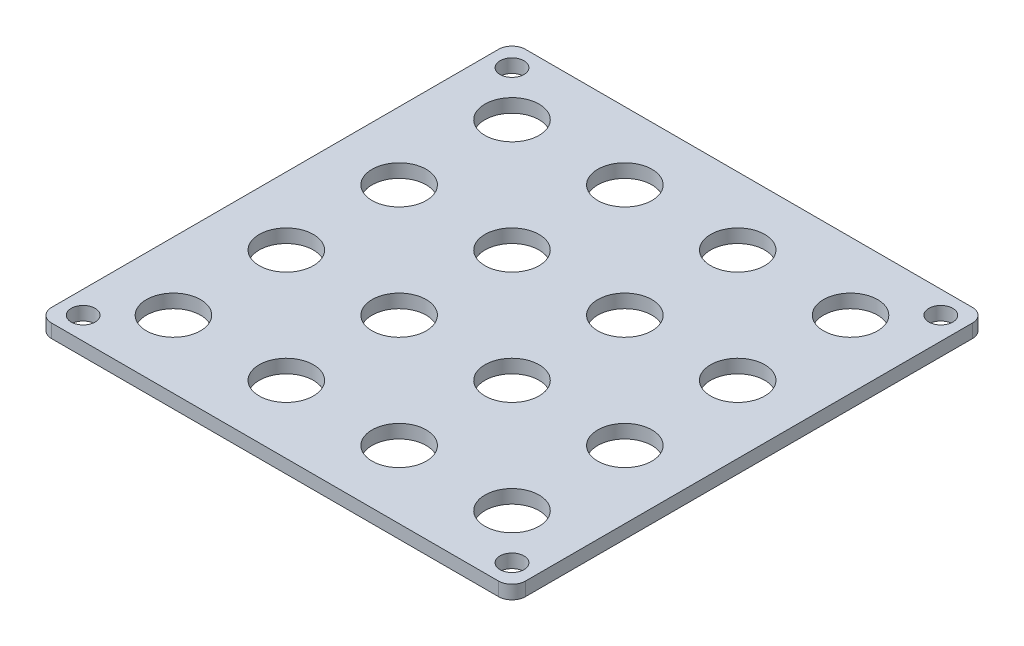
ISO-10303-21;
HEADER;
FILE_DESCRIPTION(('STEP AP214'),'2;1');
FILE_NAME('part.step','',(''),(''),'','','');
FILE_SCHEMA(('AUTOMOTIVE_DESIGN { 1 0 10303 214 1 1 1 1 }'));
ENDSEC;
DATA;
#1=APPLICATION_CONTEXT('core data for automotive mechanical design processes');
#2=APPLICATION_PROTOCOL_DEFINITION('international standard','automotive_design',2000,#1);
#3=PRODUCT_CONTEXT('',#1,'mechanical');
#4=PRODUCT('Part','Part','',(#3));
#5=PRODUCT_RELATED_PRODUCT_CATEGORY('part','',(#4));
#6=PRODUCT_DEFINITION_FORMATION('','',#4);
#7=PRODUCT_DEFINITION_CONTEXT('part definition',#1,'design');
#8=PRODUCT_DEFINITION('design','',#6,#7);
#9=PRODUCT_DEFINITION_SHAPE('','',#8);
#10=(LENGTH_UNIT() NAMED_UNIT(*) SI_UNIT(.MILLI.,.METRE.));
#11=(NAMED_UNIT(*) PLANE_ANGLE_UNIT() SI_UNIT($,.RADIAN.));
#12=(NAMED_UNIT(*) SI_UNIT($,.STERADIAN.) SOLID_ANGLE_UNIT());
#13=UNCERTAINTY_MEASURE_WITH_UNIT(LENGTH_MEASURE(1.E-05),#10,'distance_accuracy_value','');
#14=(GEOMETRIC_REPRESENTATION_CONTEXT(3) GLOBAL_UNCERTAINTY_ASSIGNED_CONTEXT((#13)) GLOBAL_UNIT_ASSIGNED_CONTEXT((#10,
#11,#12)) REPRESENTATION_CONTEXT('',''));
#15=CARTESIAN_POINT('',(0.,0.,0.));
#16=DIRECTION('',(0.,0.,1.));
#17=DIRECTION('',(1.,0.,0.));
#18=AXIS2_PLACEMENT_3D('',#15,#16,#17);
#19=CARTESIAN_POINT('',(0.,3.,0.));
#20=DIRECTION('',(0.,1.,0.));
#21=DIRECTION('',(0.,0.,1.));
#22=AXIS2_PLACEMENT_3D('',#19,#20,#21);
#23=PLANE('',#22);
#24=CARTESIAN_POINT('',(-10.,3.,-10.));
#25=DIRECTION('',(0.,1.,0.));
#26=DIRECTION('',(0.,0.,1.));
#27=AXIS2_PLACEMENT_3D('',#24,#25,#26);
#28=CIRCLE('',#27,2.64999999999999);
#29=CARTESIAN_POINT('',(-10.,3.,-7.35000000000001));
#30=VERTEX_POINT('',#29);
#31=EDGE_CURVE('E297',#30,#30,#28,.T.);
#32=ORIENTED_EDGE('',*,*,#31,.F.);
#33=EDGE_LOOP('',(#32));
#34=FACE_BOUND('',#33,.T.);
#35=CARTESIAN_POINT('',(-10.,3.,85.));
#36=DIRECTION('',(0.,1.,0.));
#37=DIRECTION('',(0.,0.,1.));
#38=AXIS2_PLACEMENT_3D('',#35,#36,#37);
#39=CIRCLE('',#38,2.64999999999999);
#40=CARTESIAN_POINT('',(-10.,3.,87.65));
#41=VERTEX_POINT('',#40);
#42=EDGE_CURVE('E291',#41,#41,#39,.T.);
#43=ORIENTED_EDGE('',*,*,#42,.F.);
#44=EDGE_LOOP('',(#43));
#45=FACE_BOUND('',#44,.T.);
#46=CARTESIAN_POINT('',(85.,3.,85.));
#47=DIRECTION('',(0.,1.,0.));
#48=DIRECTION('',(0.,0.,1.));
#49=AXIS2_PLACEMENT_3D('',#46,#47,#48);
#50=CIRCLE('',#49,2.64999999999999);
#51=CARTESIAN_POINT('',(85.,3.,87.65));
#52=VERTEX_POINT('',#51);
#53=EDGE_CURVE('E285',#52,#52,#50,.T.);
#54=ORIENTED_EDGE('',*,*,#53,.F.);
#55=EDGE_LOOP('',(#54));
#56=FACE_BOUND('',#55,.T.);
#57=CARTESIAN_POINT('',(85.,3.,-10.));
#58=DIRECTION('',(0.,1.,0.));
#59=DIRECTION('',(0.,0.,1.));
#60=AXIS2_PLACEMENT_3D('',#57,#58,#59);
#61=CIRCLE('',#60,2.64999999999999);
#62=CARTESIAN_POINT('',(85.,3.,-7.35000000000001));
#63=VERTEX_POINT('',#62);
#64=EDGE_CURVE('E279',#63,#63,#61,.T.);
#65=ORIENTED_EDGE('',*,*,#64,.F.);
#66=EDGE_LOOP('',(#65));
#67=FACE_BOUND('',#66,.T.);
#68=CARTESIAN_POINT('',(25.,3.,75.));
#69=DIRECTION('',(0.,1.,0.));
#70=DIRECTION('',(0.,0.,1.));
#71=AXIS2_PLACEMENT_3D('',#68,#69,#70);
#72=CIRCLE('',#71,6.);
#73=CARTESIAN_POINT('',(25.,3.,81.));
#74=VERTEX_POINT('',#73);
#75=EDGE_CURVE('E262',#74,#74,#72,.T.);
#76=ORIENTED_EDGE('',*,*,#75,.F.);
#77=EDGE_LOOP('',(#76));
#78=FACE_BOUND('',#77,.T.);
#79=CARTESIAN_POINT('',(0.,3.,75.));
#80=DIRECTION('',(0.,1.,0.));
#81=DIRECTION('',(0.,0.,1.));
#82=AXIS2_PLACEMENT_3D('',#79,#80,#81);
#83=CIRCLE('',#82,6.);
#84=CARTESIAN_POINT('',(0.,3.,81.));
#85=VERTEX_POINT('',#84);
#86=EDGE_CURVE('E250',#85,#85,#83,.T.);
#87=ORIENTED_EDGE('',*,*,#86,.F.);
#88=EDGE_LOOP('',(#87));
#89=FACE_BOUND('',#88,.T.);
#90=CARTESIAN_POINT('',(0.,3.,25.));
#91=DIRECTION('',(0.,1.,0.));
#92=DIRECTION('',(0.,0.,1.));
#93=AXIS2_PLACEMENT_3D('',#90,#91,#92);
#94=CIRCLE('',#93,6.);
#95=CARTESIAN_POINT('',(0.,3.,31.));
#96=VERTEX_POINT('',#95);
#97=EDGE_CURVE('E238',#96,#96,#94,.T.);
#98=ORIENTED_EDGE('',*,*,#97,.F.);
#99=EDGE_LOOP('',(#98));
#100=FACE_BOUND('',#99,.T.);
#101=CARTESIAN_POINT('',(50.,3.,50.));
#102=DIRECTION('',(0.,1.,0.));
#103=DIRECTION('',(0.,0.,1.));
#104=AXIS2_PLACEMENT_3D('',#101,#102,#103);
#105=CIRCLE('',#104,6.);
#106=CARTESIAN_POINT('',(50.,3.,56.));
#107=VERTEX_POINT('',#106);
#108=EDGE_CURVE('E226',#107,#107,#105,.T.);
#109=ORIENTED_EDGE('',*,*,#108,.F.);
#110=EDGE_LOOP('',(#109));
#111=FACE_BOUND('',#110,.T.);
#112=CARTESIAN_POINT('',(75.,3.,25.));
#113=DIRECTION('',(0.,1.,0.));
#114=DIRECTION('',(0.,0.,1.));
#115=AXIS2_PLACEMENT_3D('',#112,#113,#114);
#116=CIRCLE('',#115,6.);
#117=CARTESIAN_POINT('',(75.,3.,31.));
#118=VERTEX_POINT('',#117);
#119=EDGE_CURVE('E214',#118,#118,#116,.T.);
#120=ORIENTED_EDGE('',*,*,#119,.F.);
#121=EDGE_LOOP('',(#120));
#122=FACE_BOUND('',#121,.T.);
#123=CARTESIAN_POINT('',(25.,3.,25.));
#124=DIRECTION('',(0.,1.,0.));
#125=DIRECTION('',(0.,0.,1.));
#126=AXIS2_PLACEMENT_3D('',#123,#124,#125);
#127=CIRCLE('',#126,6.);
#128=CARTESIAN_POINT('',(25.,3.,31.));
#129=VERTEX_POINT('',#128);
#130=EDGE_CURVE('E202',#129,#129,#127,.T.);
#131=ORIENTED_EDGE('',*,*,#130,.F.);
#132=EDGE_LOOP('',(#131));
#133=FACE_BOUND('',#132,.T.);
#134=CARTESIAN_POINT('',(50.,3.,0.));
#135=DIRECTION('',(0.,1.,0.));
#136=DIRECTION('',(0.,0.,1.));
#137=AXIS2_PLACEMENT_3D('',#134,#135,#136);
#138=CIRCLE('',#137,6.);
#139=CARTESIAN_POINT('',(50.,3.,6.));
#140=VERTEX_POINT('',#139);
#141=EDGE_CURVE('E190',#140,#140,#138,.T.);
#142=ORIENTED_EDGE('',*,*,#141,.F.);
#143=EDGE_LOOP('',(#142));
#144=FACE_BOUND('',#143,.T.);
#145=CARTESIAN_POINT('',(0.,3.,0.));
#146=DIRECTION('',(0.,1.,0.));
#147=DIRECTION('',(0.,0.,1.));
#148=AXIS2_PLACEMENT_3D('',#145,#146,#147);
#149=CIRCLE('',#148,6.);
#150=CARTESIAN_POINT('',(0.,3.,6.));
#151=VERTEX_POINT('',#150);
#152=EDGE_CURVE('E131',#151,#151,#149,.T.);
#153=ORIENTED_EDGE('',*,*,#152,.F.);
#154=EDGE_LOOP('',(#153));
#155=FACE_BOUND('',#154,.T.);
#156=DIRECTION('',(-1.,0.,0.));
#157=VECTOR('',#156,1.);
#158=CARTESIAN_POINT('',(90.,3.,-15.));
#159=LINE('',#158,#157);
#160=CARTESIAN_POINT('',(87.,3.,-15.));
#161=VERTEX_POINT('',#160);
#162=CARTESIAN_POINT('',(-12.,3.,-15.));
#163=VERTEX_POINT('',#162);
#164=EDGE_CURVE('E140',#161,#163,#159,.T.);
#165=ORIENTED_EDGE('',*,*,#164,.T.);
#166=CARTESIAN_POINT('',(-12.,3.,-12.));
#167=DIRECTION('',(0.,1.,0.));
#168=DIRECTION('',(0.,0.,1.));
#169=AXIS2_PLACEMENT_3D('',#166,#167,#168);
#170=CIRCLE('',#169,3.);
#171=CARTESIAN_POINT('',(-15.,3.,-12.));
#172=VERTEX_POINT('',#171);
#173=EDGE_CURVE('E159',#163,#172,#170,.T.);
#174=ORIENTED_EDGE('',*,*,#173,.T.);
#175=DIRECTION('',(0.,0.,1.));
#176=VECTOR('',#175,1.);
#177=CARTESIAN_POINT('',(-15.,3.,90.));
#178=LINE('',#177,#176);
#179=CARTESIAN_POINT('',(-15.,3.,87.));
#180=VERTEX_POINT('',#179);
#181=EDGE_CURVE('E123',#172,#180,#178,.T.);
#182=ORIENTED_EDGE('',*,*,#181,.T.);
#183=CARTESIAN_POINT('',(-12.,3.,87.));
#184=DIRECTION('',(0.,1.,0.));
#185=DIRECTION('',(0.,0.,1.));
#186=AXIS2_PLACEMENT_3D('',#183,#184,#185);
#187=CIRCLE('',#186,3.);
#188=CARTESIAN_POINT('',(-12.,3.,90.));
#189=VERTEX_POINT('',#188);
#190=EDGE_CURVE('E154',#180,#189,#187,.T.);
#191=ORIENTED_EDGE('',*,*,#190,.T.);
#192=DIRECTION('',(1.,0.,0.));
#193=VECTOR('',#192,1.);
#194=CARTESIAN_POINT('',(90.,3.,90.));
#195=LINE('',#194,#193);
#196=CARTESIAN_POINT('',(87.,3.,90.));
#197=VERTEX_POINT('',#196);
#198=EDGE_CURVE('E170',#189,#197,#195,.T.);
#199=ORIENTED_EDGE('',*,*,#198,.T.);
#200=CARTESIAN_POINT('',(87.,3.,87.));
#201=DIRECTION('',(0.,1.,0.));
#202=DIRECTION('',(0.,0.,1.));
#203=AXIS2_PLACEMENT_3D('',#200,#201,#202);
#204=CIRCLE('',#203,3.);
#205=CARTESIAN_POINT('',(90.,3.,87.));
#206=VERTEX_POINT('',#205);
#207=EDGE_CURVE('E59',#197,#206,#204,.T.);
#208=ORIENTED_EDGE('',*,*,#207,.T.);
#209=DIRECTION('',(0.,0.,-1.));
#210=VECTOR('',#209,1.);
#211=CARTESIAN_POINT('',(90.,3.,90.));
#212=LINE('',#211,#210);
#213=CARTESIAN_POINT('',(90.,3.,-12.));
#214=VERTEX_POINT('',#213);
#215=EDGE_CURVE('E178',#206,#214,#212,.T.);
#216=ORIENTED_EDGE('',*,*,#215,.T.);
#217=CARTESIAN_POINT('',(87.,3.,-12.));
#218=DIRECTION('',(0.,1.,0.));
#219=DIRECTION('',(0.,0.,1.));
#220=AXIS2_PLACEMENT_3D('',#217,#218,#219);
#221=CIRCLE('',#220,3.);
#222=EDGE_CURVE('E157',#214,#161,#221,.T.);
#223=ORIENTED_EDGE('',*,*,#222,.T.);
#224=EDGE_LOOP('',(#165,#174,#182,#191,#199,#208,#216,#223));
#225=FACE_BOUND('',#224,.T.);
#226=CARTESIAN_POINT('',(25.,3.,0.));
#227=DIRECTION('',(0.,1.,0.));
#228=DIRECTION('',(0.,0.,1.));
#229=AXIS2_PLACEMENT_3D('',#226,#227,#228);
#230=CIRCLE('',#229,6.);
#231=CARTESIAN_POINT('',(25.,3.,6.));
#232=VERTEX_POINT('',#231);
#233=EDGE_CURVE('E185',#232,#232,#230,.T.);
#234=ORIENTED_EDGE('',*,*,#233,.F.);
#235=EDGE_LOOP('',(#234));
#236=FACE_BOUND('',#235,.T.);
#237=CARTESIAN_POINT('',(75.,3.,0.));
#238=DIRECTION('',(0.,1.,0.));
#239=DIRECTION('',(0.,0.,1.));
#240=AXIS2_PLACEMENT_3D('',#237,#238,#239);
#241=CIRCLE('',#240,6.);
#242=CARTESIAN_POINT('',(75.,3.,6.));
#243=VERTEX_POINT('',#242);
#244=EDGE_CURVE('E196',#243,#243,#241,.T.);
#245=ORIENTED_EDGE('',*,*,#244,.F.);
#246=EDGE_LOOP('',(#245));
#247=FACE_BOUND('',#246,.T.);
#248=CARTESIAN_POINT('',(50.,3.,25.));
#249=DIRECTION('',(0.,1.,0.));
#250=DIRECTION('',(0.,0.,1.));
#251=AXIS2_PLACEMENT_3D('',#248,#249,#250);
#252=CIRCLE('',#251,6.);
#253=CARTESIAN_POINT('',(50.,3.,31.));
#254=VERTEX_POINT('',#253);
#255=EDGE_CURVE('E208',#254,#254,#252,.T.);
#256=ORIENTED_EDGE('',*,*,#255,.F.);
#257=EDGE_LOOP('',(#256));
#258=FACE_BOUND('',#257,.T.);
#259=CARTESIAN_POINT('',(25.,3.,50.));
#260=DIRECTION('',(0.,1.,0.));
#261=DIRECTION('',(0.,0.,1.));
#262=AXIS2_PLACEMENT_3D('',#259,#260,#261);
#263=CIRCLE('',#262,6.);
#264=CARTESIAN_POINT('',(25.,3.,56.));
#265=VERTEX_POINT('',#264);
#266=EDGE_CURVE('E220',#265,#265,#263,.T.);
#267=ORIENTED_EDGE('',*,*,#266,.F.);
#268=EDGE_LOOP('',(#267));
#269=FACE_BOUND('',#268,.T.);
#270=CARTESIAN_POINT('',(75.,3.,50.));
#271=DIRECTION('',(0.,1.,0.));
#272=DIRECTION('',(0.,0.,1.));
#273=AXIS2_PLACEMENT_3D('',#270,#271,#272);
#274=CIRCLE('',#273,6.);
#275=CARTESIAN_POINT('',(75.,3.,56.));
#276=VERTEX_POINT('',#275);
#277=EDGE_CURVE('E232',#276,#276,#274,.T.);
#278=ORIENTED_EDGE('',*,*,#277,.F.);
#279=EDGE_LOOP('',(#278));
#280=FACE_BOUND('',#279,.T.);
#281=CARTESIAN_POINT('',(0.,3.,50.));
#282=DIRECTION('',(0.,1.,0.));
#283=DIRECTION('',(0.,0.,1.));
#284=AXIS2_PLACEMENT_3D('',#281,#282,#283);
#285=CIRCLE('',#284,6.);
#286=CARTESIAN_POINT('',(0.,3.,56.));
#287=VERTEX_POINT('',#286);
#288=EDGE_CURVE('E244',#287,#287,#285,.T.);
#289=ORIENTED_EDGE('',*,*,#288,.F.);
#290=EDGE_LOOP('',(#289));
#291=FACE_BOUND('',#290,.T.);
#292=CARTESIAN_POINT('',(75.,3.,75.));
#293=DIRECTION('',(0.,1.,0.));
#294=DIRECTION('',(0.,0.,1.));
#295=AXIS2_PLACEMENT_3D('',#292,#293,#294);
#296=CIRCLE('',#295,6.);
#297=CARTESIAN_POINT('',(75.,3.,81.));
#298=VERTEX_POINT('',#297);
#299=EDGE_CURVE('E256',#298,#298,#296,.T.);
#300=ORIENTED_EDGE('',*,*,#299,.F.);
#301=EDGE_LOOP('',(#300));
#302=FACE_BOUND('',#301,.T.);
#303=CARTESIAN_POINT('',(50.,3.,75.));
#304=DIRECTION('',(0.,1.,0.));
#305=DIRECTION('',(0.,0.,1.));
#306=AXIS2_PLACEMENT_3D('',#303,#304,#305);
#307=CIRCLE('',#306,6.);
#308=CARTESIAN_POINT('',(50.,3.,81.));
#309=VERTEX_POINT('',#308);
#310=EDGE_CURVE('E268',#309,#309,#307,.T.);
#311=ORIENTED_EDGE('',*,*,#310,.F.);
#312=EDGE_LOOP('',(#311));
#313=FACE_BOUND('',#312,.T.);
#314=ADVANCED_FACE('F37',(#34,#45,#56,#67,#78,#89,#100,#111,#122,#133,#144,#155,#225,#236,#247,
#258,#269,#280,#291,#302,#313),#23,.T.);
#315=CARTESIAN_POINT('',(0.,0.,0.));
#316=DIRECTION('',(0.,1.,0.));
#317=DIRECTION('',(0.,0.,1.));
#318=AXIS2_PLACEMENT_3D('',#315,#316,#317);
#319=PLANE('',#318);
#320=CARTESIAN_POINT('',(-10.,0.,-10.));
#321=DIRECTION('',(0.,1.,0.));
#322=DIRECTION('',(0.,0.,1.));
#323=AXIS2_PLACEMENT_3D('',#320,#321,#322);
#324=CIRCLE('',#323,2.64999999999999);
#325=CARTESIAN_POINT('',(-10.,0.,-7.35));
#326=VERTEX_POINT('',#325);
#327=EDGE_CURVE('E294',#326,#326,#324,.T.);
#328=ORIENTED_EDGE('',*,*,#327,.T.);
#329=EDGE_LOOP('',(#328));
#330=FACE_BOUND('',#329,.T.);
#331=CARTESIAN_POINT('',(-10.,0.,85.));
#332=DIRECTION('',(0.,1.,0.));
#333=DIRECTION('',(0.,0.,1.));
#334=AXIS2_PLACEMENT_3D('',#331,#332,#333);
#335=CIRCLE('',#334,2.64999999999999);
#336=CARTESIAN_POINT('',(-10.,0.,87.65));
#337=VERTEX_POINT('',#336);
#338=EDGE_CURVE('E288',#337,#337,#335,.T.);
#339=ORIENTED_EDGE('',*,*,#338,.T.);
#340=EDGE_LOOP('',(#339));
#341=FACE_BOUND('',#340,.T.);
#342=CARTESIAN_POINT('',(85.,0.,85.));
#343=DIRECTION('',(0.,1.,0.));
#344=DIRECTION('',(0.,0.,1.));
#345=AXIS2_PLACEMENT_3D('',#342,#343,#344);
#346=CIRCLE('',#345,2.64999999999999);
#347=CARTESIAN_POINT('',(85.,0.,87.65));
#348=VERTEX_POINT('',#347);
#349=EDGE_CURVE('E282',#348,#348,#346,.T.);
#350=ORIENTED_EDGE('',*,*,#349,.T.);
#351=EDGE_LOOP('',(#350));
#352=FACE_BOUND('',#351,.T.);
#353=CARTESIAN_POINT('',(85.,0.,-10.));
#354=DIRECTION('',(0.,1.,0.));
#355=DIRECTION('',(0.,0.,1.));
#356=AXIS2_PLACEMENT_3D('',#353,#354,#355);
#357=CIRCLE('',#356,2.64999999999999);
#358=CARTESIAN_POINT('',(85.,0.,-7.35000000000001));
#359=VERTEX_POINT('',#358);
#360=EDGE_CURVE('E274',#359,#359,#357,.T.);
#361=ORIENTED_EDGE('',*,*,#360,.T.);
#362=EDGE_LOOP('',(#361));
#363=FACE_BOUND('',#362,.T.);
#364=DIRECTION('',(0.,0.,1.));
#365=VECTOR('',#364,1.);
#366=CARTESIAN_POINT('',(-15.,0.,90.));
#367=LINE('',#366,#365);
#368=CARTESIAN_POINT('',(-15.,0.,-12.));
#369=VERTEX_POINT('',#368);
#370=CARTESIAN_POINT('',(-15.,0.,87.));
#371=VERTEX_POINT('',#370);
#372=EDGE_CURVE('E120',#369,#371,#367,.T.);
#373=ORIENTED_EDGE('',*,*,#372,.F.);
#374=CARTESIAN_POINT('',(-12.,0.,-12.));
#375=DIRECTION('',(0.,1.,0.));
#376=DIRECTION('',(0.,0.,1.));
#377=AXIS2_PLACEMENT_3D('',#374,#375,#376);
#378=CIRCLE('',#377,3.);
#379=CARTESIAN_POINT('',(-12.,0.,-15.));
#380=VERTEX_POINT('',#379);
#381=EDGE_CURVE('E103',#369,#380,#378,.F.);
#382=ORIENTED_EDGE('',*,*,#381,.T.);
#383=DIRECTION('',(-1.,0.,0.));
#384=VECTOR('',#383,1.);
#385=CARTESIAN_POINT('',(90.,0.,-15.));
#386=LINE('',#385,#384);
#387=CARTESIAN_POINT('',(87.,0.,-15.));
#388=VERTEX_POINT('',#387);
#389=EDGE_CURVE('E144',#388,#380,#386,.T.);
#390=ORIENTED_EDGE('',*,*,#389,.F.);
#391=CARTESIAN_POINT('',(87.,0.,-12.));
#392=DIRECTION('',(0.,1.,0.));
#393=DIRECTION('',(0.,0.,1.));
#394=AXIS2_PLACEMENT_3D('',#391,#392,#393);
#395=CIRCLE('',#394,3.);
#396=CARTESIAN_POINT('',(90.,0.,-12.));
#397=VERTEX_POINT('',#396);
#398=EDGE_CURVE('E114',#388,#397,#395,.F.);
#399=ORIENTED_EDGE('',*,*,#398,.T.);
#400=DIRECTION('',(0.,0.,-1.));
#401=VECTOR('',#400,1.);
#402=CARTESIAN_POINT('',(90.,0.,90.));
#403=LINE('',#402,#401);
#404=CARTESIAN_POINT('',(90.,0.,87.));
#405=VERTEX_POINT('',#404);
#406=EDGE_CURVE('E134',#405,#397,#403,.T.);
#407=ORIENTED_EDGE('',*,*,#406,.F.);
#408=CARTESIAN_POINT('',(87.,0.,87.));
#409=DIRECTION('',(0.,1.,0.));
#410=DIRECTION('',(0.,0.,1.));
#411=AXIS2_PLACEMENT_3D('',#408,#409,#410);
#412=CIRCLE('',#411,3.);
#413=CARTESIAN_POINT('',(87.,0.,90.));
#414=VERTEX_POINT('',#413);
#415=EDGE_CURVE('E148',#405,#414,#412,.F.);
#416=ORIENTED_EDGE('',*,*,#415,.T.);
#417=DIRECTION('',(1.,0.,0.));
#418=VECTOR('',#417,1.);
#419=CARTESIAN_POINT('',(90.,0.,90.));
#420=LINE('',#419,#418);
#421=CARTESIAN_POINT('',(-12.,0.,90.));
#422=VERTEX_POINT('',#421);
#423=EDGE_CURVE('E130',#422,#414,#420,.T.);
#424=ORIENTED_EDGE('',*,*,#423,.F.);
#425=CARTESIAN_POINT('',(-12.,0.,87.));
#426=DIRECTION('',(0.,1.,0.));
#427=DIRECTION('',(0.,0.,1.));
#428=AXIS2_PLACEMENT_3D('',#425,#426,#427);
#429=CIRCLE('',#428,3.);
#430=EDGE_CURVE('E124',#422,#371,#429,.F.);
#431=ORIENTED_EDGE('',*,*,#430,.T.);
#432=EDGE_LOOP('',(#373,#382,#390,#399,#407,#416,#424,#431));
#433=FACE_BOUND('',#432,.T.);
#434=CARTESIAN_POINT('',(0.,0.,0.));
#435=DIRECTION('',(0.,1.,0.));
#436=DIRECTION('',(0.,0.,1.));
#437=AXIS2_PLACEMENT_3D('',#434,#435,#436);
#438=CIRCLE('',#437,6.);
#439=CARTESIAN_POINT('',(0.,0.,6.));
#440=VERTEX_POINT('',#439);
#441=EDGE_CURVE('E137',#440,#440,#438,.T.);
#442=ORIENTED_EDGE('',*,*,#441,.T.);
#443=EDGE_LOOP('',(#442));
#444=FACE_BOUND('',#443,.T.);
#445=CARTESIAN_POINT('',(25.,0.,0.));
#446=DIRECTION('',(0.,1.,0.));
#447=DIRECTION('',(0.,0.,1.));
#448=AXIS2_PLACEMENT_3D('',#445,#446,#447);
#449=CIRCLE('',#448,6.);
#450=CARTESIAN_POINT('',(25.,0.,6.));
#451=VERTEX_POINT('',#450);
#452=EDGE_CURVE('E187',#451,#451,#449,.T.);
#453=ORIENTED_EDGE('',*,*,#452,.T.);
#454=EDGE_LOOP('',(#453));
#455=FACE_BOUND('',#454,.T.);
#456=CARTESIAN_POINT('',(50.,0.,0.));
#457=DIRECTION('',(0.,1.,0.));
#458=DIRECTION('',(0.,0.,1.));
#459=AXIS2_PLACEMENT_3D('',#456,#457,#458);
#460=CIRCLE('',#459,6.);
#461=CARTESIAN_POINT('',(50.,0.,6.));
#462=VERTEX_POINT('',#461);
#463=EDGE_CURVE('E193',#462,#462,#460,.T.);
#464=ORIENTED_EDGE('',*,*,#463,.T.);
#465=EDGE_LOOP('',(#464));
#466=FACE_BOUND('',#465,.T.);
#467=CARTESIAN_POINT('',(75.,0.,0.));
#468=DIRECTION('',(0.,1.,0.));
#469=DIRECTION('',(0.,0.,1.));
#470=AXIS2_PLACEMENT_3D('',#467,#468,#469);
#471=CIRCLE('',#470,6.);
#472=CARTESIAN_POINT('',(75.,0.,6.));
#473=VERTEX_POINT('',#472);
#474=EDGE_CURVE('E199',#473,#473,#471,.T.);
#475=ORIENTED_EDGE('',*,*,#474,.T.);
#476=EDGE_LOOP('',(#475));
#477=FACE_BOUND('',#476,.T.);
#478=CARTESIAN_POINT('',(25.,0.,25.));
#479=DIRECTION('',(0.,1.,0.));
#480=DIRECTION('',(0.,0.,1.));
#481=AXIS2_PLACEMENT_3D('',#478,#479,#480);
#482=CIRCLE('',#481,6.);
#483=CARTESIAN_POINT('',(25.,0.,31.));
#484=VERTEX_POINT('',#483);
#485=EDGE_CURVE('E205',#484,#484,#482,.T.);
#486=ORIENTED_EDGE('',*,*,#485,.T.);
#487=EDGE_LOOP('',(#486));
#488=FACE_BOUND('',#487,.T.);
#489=CARTESIAN_POINT('',(50.,0.,25.));
#490=DIRECTION('',(0.,1.,0.));
#491=DIRECTION('',(0.,0.,1.));
#492=AXIS2_PLACEMENT_3D('',#489,#490,#491);
#493=CIRCLE('',#492,6.);
#494=CARTESIAN_POINT('',(50.,0.,31.));
#495=VERTEX_POINT('',#494);
#496=EDGE_CURVE('E211',#495,#495,#493,.T.);
#497=ORIENTED_EDGE('',*,*,#496,.T.);
#498=EDGE_LOOP('',(#497));
#499=FACE_BOUND('',#498,.T.);
#500=CARTESIAN_POINT('',(75.,0.,25.));
#501=DIRECTION('',(0.,1.,0.));
#502=DIRECTION('',(0.,0.,1.));
#503=AXIS2_PLACEMENT_3D('',#500,#501,#502);
#504=CIRCLE('',#503,6.);
#505=CARTESIAN_POINT('',(75.,0.,31.));
#506=VERTEX_POINT('',#505);
#507=EDGE_CURVE('E217',#506,#506,#504,.T.);
#508=ORIENTED_EDGE('',*,*,#507,.T.);
#509=EDGE_LOOP('',(#508));
#510=FACE_BOUND('',#509,.T.);
#511=CARTESIAN_POINT('',(25.,0.,50.));
#512=DIRECTION('',(0.,1.,0.));
#513=DIRECTION('',(0.,0.,1.));
#514=AXIS2_PLACEMENT_3D('',#511,#512,#513);
#515=CIRCLE('',#514,6.);
#516=CARTESIAN_POINT('',(25.,0.,56.));
#517=VERTEX_POINT('',#516);
#518=EDGE_CURVE('E223',#517,#517,#515,.T.);
#519=ORIENTED_EDGE('',*,*,#518,.T.);
#520=EDGE_LOOP('',(#519));
#521=FACE_BOUND('',#520,.T.);
#522=CARTESIAN_POINT('',(50.,0.,50.));
#523=DIRECTION('',(0.,1.,0.));
#524=DIRECTION('',(0.,0.,1.));
#525=AXIS2_PLACEMENT_3D('',#522,#523,#524);
#526=CIRCLE('',#525,6.);
#527=CARTESIAN_POINT('',(50.,0.,56.));
#528=VERTEX_POINT('',#527);
#529=EDGE_CURVE('E229',#528,#528,#526,.T.);
#530=ORIENTED_EDGE('',*,*,#529,.T.);
#531=EDGE_LOOP('',(#530));
#532=FACE_BOUND('',#531,.T.);
#533=CARTESIAN_POINT('',(75.,0.,50.));
#534=DIRECTION('',(0.,1.,0.));
#535=DIRECTION('',(0.,0.,1.));
#536=AXIS2_PLACEMENT_3D('',#533,#534,#535);
#537=CIRCLE('',#536,6.);
#538=CARTESIAN_POINT('',(75.,0.,56.));
#539=VERTEX_POINT('',#538);
#540=EDGE_CURVE('E235',#539,#539,#537,.T.);
#541=ORIENTED_EDGE('',*,*,#540,.T.);
#542=EDGE_LOOP('',(#541));
#543=FACE_BOUND('',#542,.T.);
#544=CARTESIAN_POINT('',(0.,0.,25.));
#545=DIRECTION('',(0.,1.,0.));
#546=DIRECTION('',(0.,0.,1.));
#547=AXIS2_PLACEMENT_3D('',#544,#545,#546);
#548=CIRCLE('',#547,6.);
#549=CARTESIAN_POINT('',(0.,0.,31.));
#550=VERTEX_POINT('',#549);
#551=EDGE_CURVE('E241',#550,#550,#548,.T.);
#552=ORIENTED_EDGE('',*,*,#551,.T.);
#553=EDGE_LOOP('',(#552));
#554=FACE_BOUND('',#553,.T.);
#555=CARTESIAN_POINT('',(0.,0.,50.));
#556=DIRECTION('',(0.,1.,0.));
#557=DIRECTION('',(0.,0.,1.));
#558=AXIS2_PLACEMENT_3D('',#555,#556,#557);
#559=CIRCLE('',#558,6.);
#560=CARTESIAN_POINT('',(0.,0.,56.));
#561=VERTEX_POINT('',#560);
#562=EDGE_CURVE('E247',#561,#561,#559,.T.);
#563=ORIENTED_EDGE('',*,*,#562,.T.);
#564=EDGE_LOOP('',(#563));
#565=FACE_BOUND('',#564,.T.);
#566=CARTESIAN_POINT('',(0.,0.,75.));
#567=DIRECTION('',(0.,1.,0.));
#568=DIRECTION('',(0.,0.,1.));
#569=AXIS2_PLACEMENT_3D('',#566,#567,#568);
#570=CIRCLE('',#569,6.);
#571=CARTESIAN_POINT('',(0.,0.,81.));
#572=VERTEX_POINT('',#571);
#573=EDGE_CURVE('E253',#572,#572,#570,.T.);
#574=ORIENTED_EDGE('',*,*,#573,.T.);
#575=EDGE_LOOP('',(#574));
#576=FACE_BOUND('',#575,.T.);
#577=CARTESIAN_POINT('',(75.,0.,75.));
#578=DIRECTION('',(0.,1.,0.));
#579=DIRECTION('',(0.,0.,1.));
#580=AXIS2_PLACEMENT_3D('',#577,#578,#579);
#581=CIRCLE('',#580,6.);
#582=CARTESIAN_POINT('',(75.,0.,81.));
#583=VERTEX_POINT('',#582);
#584=EDGE_CURVE('E259',#583,#583,#581,.T.);
#585=ORIENTED_EDGE('',*,*,#584,.T.);
#586=EDGE_LOOP('',(#585));
#587=FACE_BOUND('',#586,.T.);
#588=CARTESIAN_POINT('',(25.,0.,75.));
#589=DIRECTION('',(0.,1.,0.));
#590=DIRECTION('',(0.,0.,1.));
#591=AXIS2_PLACEMENT_3D('',#588,#589,#590);
#592=CIRCLE('',#591,6.);
#593=CARTESIAN_POINT('',(25.,0.,81.));
#594=VERTEX_POINT('',#593);
#595=EDGE_CURVE('E265',#594,#594,#592,.T.);
#596=ORIENTED_EDGE('',*,*,#595,.T.);
#597=EDGE_LOOP('',(#596));
#598=FACE_BOUND('',#597,.T.);
#599=CARTESIAN_POINT('',(50.,0.,75.));
#600=DIRECTION('',(0.,1.,0.));
#601=DIRECTION('',(0.,0.,1.));
#602=AXIS2_PLACEMENT_3D('',#599,#600,#601);
#603=CIRCLE('',#602,6.);
#604=CARTESIAN_POINT('',(50.,0.,81.));
#605=VERTEX_POINT('',#604);
#606=EDGE_CURVE('E271',#605,#605,#603,.T.);
#607=ORIENTED_EDGE('',*,*,#606,.T.);
#608=EDGE_LOOP('',(#607));
#609=FACE_BOUND('',#608,.T.);
#610=ADVANCED_FACE('F127',(#330,#341,#352,#363,#433,#444,#455,#466,#477,#488,#499,#510,#521,
#532,#543,#554,#565,#576,#587,#598,#609),#319,.F.);
#611=CARTESIAN_POINT('',(-15.,3.,90.));
#612=DIRECTION('',(1.,0.,0.));
#613=DIRECTION('',(0.,0.,-1.));
#614=AXIS2_PLACEMENT_3D('',#611,#612,#613);
#615=PLANE('',#614);
#616=ORIENTED_EDGE('',*,*,#181,.F.);
#617=DIRECTION('',(0.,-1.,0.));
#618=VECTOR('',#617,1.);
#619=CARTESIAN_POINT('',(-15.,3.,-12.));
#620=LINE('',#619,#618);
#621=EDGE_CURVE('E107',#172,#369,#620,.T.);
#622=ORIENTED_EDGE('',*,*,#621,.T.);
#623=ORIENTED_EDGE('',*,*,#372,.T.);
#624=DIRECTION('',(0.,-1.,0.));
#625=VECTOR('',#624,1.);
#626=CARTESIAN_POINT('',(-15.,3.,87.));
#627=LINE('',#626,#625);
#628=EDGE_CURVE('E125',#371,#180,#627,.F.);
#629=ORIENTED_EDGE('',*,*,#628,.T.);
#630=EDGE_LOOP('',(#616,#622,#623,#629));
#631=FACE_BOUND('',#630,.T.);
#632=ADVANCED_FACE('F119',(#631),#615,.F.);
#633=CARTESIAN_POINT('',(90.,3.,90.));
#634=DIRECTION('',(0.,0.,-1.));
#635=DIRECTION('',(-1.,0.,0.));
#636=AXIS2_PLACEMENT_3D('',#633,#634,#635);
#637=PLANE('',#636);
#638=ORIENTED_EDGE('',*,*,#423,.T.);
#639=DIRECTION('',(0.,-1.,0.));
#640=VECTOR('',#639,1.);
#641=CARTESIAN_POINT('',(87.,3.,90.));
#642=LINE('',#641,#640);
#643=EDGE_CURVE('E11',#414,#197,#642,.F.);
#644=ORIENTED_EDGE('',*,*,#643,.T.);
#645=ORIENTED_EDGE('',*,*,#198,.F.);
#646=DIRECTION('',(0.,-1.,0.));
#647=VECTOR('',#646,1.);
#648=CARTESIAN_POINT('',(-12.,3.,90.));
#649=LINE('',#648,#647);
#650=EDGE_CURVE('E45',#189,#422,#649,.T.);
#651=ORIENTED_EDGE('',*,*,#650,.T.);
#652=EDGE_LOOP('',(#638,#644,#645,#651));
#653=FACE_BOUND('',#652,.T.);
#654=ADVANCED_FACE('F168',(#653),#637,.F.);
#655=CARTESIAN_POINT('',(90.,3.,90.));
#656=DIRECTION('',(-1.,0.,0.));
#657=DIRECTION('',(0.,0.,1.));
#658=AXIS2_PLACEMENT_3D('',#655,#656,#657);
#659=PLANE('',#658);
#660=ORIENTED_EDGE('',*,*,#406,.T.);
#661=DIRECTION('',(0.,-1.,0.));
#662=VECTOR('',#661,1.);
#663=CARTESIAN_POINT('',(90.,3.,-12.));
#664=LINE('',#663,#662);
#665=EDGE_CURVE('E52',#397,#214,#664,.F.);
#666=ORIENTED_EDGE('',*,*,#665,.T.);
#667=ORIENTED_EDGE('',*,*,#215,.F.);
#668=DIRECTION('',(0.,-1.,0.));
#669=VECTOR('',#668,1.);
#670=CARTESIAN_POINT('',(90.,3.,87.));
#671=LINE('',#670,#669);
#672=EDGE_CURVE('E161',#206,#405,#671,.T.);
#673=ORIENTED_EDGE('',*,*,#672,.T.);
#674=EDGE_LOOP('',(#660,#666,#667,#673));
#675=FACE_BOUND('',#674,.T.);
#676=ADVANCED_FACE('F177',(#675),#659,.F.);
#677=CARTESIAN_POINT('',(90.,3.,-15.));
#678=DIRECTION('',(0.,0.,1.));
#679=DIRECTION('',(1.,0.,0.));
#680=AXIS2_PLACEMENT_3D('',#677,#678,#679);
#681=PLANE('',#680);
#682=ORIENTED_EDGE('',*,*,#389,.T.);
#683=DIRECTION('',(0.,-1.,0.));
#684=VECTOR('',#683,1.);
#685=CARTESIAN_POINT('',(-12.,3.,-15.));
#686=LINE('',#685,#684);
#687=EDGE_CURVE('E108',#380,#163,#686,.F.);
#688=ORIENTED_EDGE('',*,*,#687,.T.);
#689=ORIENTED_EDGE('',*,*,#164,.F.);
#690=DIRECTION('',(0.,-1.,0.));
#691=VECTOR('',#690,1.);
#692=CARTESIAN_POINT('',(87.,3.,-15.));
#693=LINE('',#692,#691);
#694=EDGE_CURVE('E113',#161,#388,#693,.T.);
#695=ORIENTED_EDGE('',*,*,#694,.T.);
#696=EDGE_LOOP('',(#682,#688,#689,#695));
#697=FACE_BOUND('',#696,.T.);
#698=ADVANCED_FACE('F363',(#697),#681,.F.);
#699=CARTESIAN_POINT('',(0.,3.,0.));
#700=DIRECTION('',(0.,-1.,0.));
#701=DIRECTION('',(0.,0.,-1.));
#702=AXIS2_PLACEMENT_3D('',#699,#700,#701);
#703=CYLINDRICAL_SURFACE('',#702,6.);
#704=ORIENTED_EDGE('',*,*,#152,.T.);
#705=EDGE_LOOP('',(#704));
#706=FACE_BOUND('',#705,.T.);
#707=ORIENTED_EDGE('',*,*,#441,.F.);
#708=EDGE_LOOP('',(#707));
#709=FACE_BOUND('',#708,.T.);
#710=ADVANCED_FACE('F366',(#706,#709),#703,.F.);
#711=CARTESIAN_POINT('',(25.,3.,0.));
#712=DIRECTION('',(0.,-1.,0.));
#713=DIRECTION('',(0.,0.,-1.));
#714=AXIS2_PLACEMENT_3D('',#711,#712,#713);
#715=CYLINDRICAL_SURFACE('',#714,6.);
#716=ORIENTED_EDGE('',*,*,#233,.T.);
#717=EDGE_LOOP('',(#716));
#718=FACE_BOUND('',#717,.T.);
#719=ORIENTED_EDGE('',*,*,#452,.F.);
#720=EDGE_LOOP('',(#719));
#721=FACE_BOUND('',#720,.T.);
#722=ADVANCED_FACE('F625',(#718,#721),#715,.F.);
#723=CARTESIAN_POINT('',(50.,3.,0.));
#724=DIRECTION('',(0.,-1.,0.));
#725=DIRECTION('',(0.,0.,-1.));
#726=AXIS2_PLACEMENT_3D('',#723,#724,#725);
#727=CYLINDRICAL_SURFACE('',#726,6.);
#728=ORIENTED_EDGE('',*,*,#141,.T.);
#729=EDGE_LOOP('',(#728));
#730=FACE_BOUND('',#729,.T.);
#731=ORIENTED_EDGE('',*,*,#463,.F.);
#732=EDGE_LOOP('',(#731));
#733=FACE_BOUND('',#732,.T.);
#734=ADVANCED_FACE('F614',(#730,#733),#727,.F.);
#735=CARTESIAN_POINT('',(75.,3.,0.));
#736=DIRECTION('',(0.,-1.,0.));
#737=DIRECTION('',(0.,0.,-1.));
#738=AXIS2_PLACEMENT_3D('',#735,#736,#737);
#739=CYLINDRICAL_SURFACE('',#738,6.);
#740=ORIENTED_EDGE('',*,*,#244,.T.);
#741=EDGE_LOOP('',(#740));
#742=FACE_BOUND('',#741,.T.);
#743=ORIENTED_EDGE('',*,*,#474,.F.);
#744=EDGE_LOOP('',(#743));
#745=FACE_BOUND('',#744,.T.);
#746=ADVANCED_FACE('F603',(#742,#745),#739,.F.);
#747=CARTESIAN_POINT('',(25.,3.,25.));
#748=DIRECTION('',(0.,-1.,0.));
#749=DIRECTION('',(0.,0.,-1.));
#750=AXIS2_PLACEMENT_3D('',#747,#748,#749);
#751=CYLINDRICAL_SURFACE('',#750,6.);
#752=ORIENTED_EDGE('',*,*,#130,.T.);
#753=EDGE_LOOP('',(#752));
#754=FACE_BOUND('',#753,.T.);
#755=ORIENTED_EDGE('',*,*,#485,.F.);
#756=EDGE_LOOP('',(#755));
#757=FACE_BOUND('',#756,.T.);
#758=ADVANCED_FACE('F592',(#754,#757),#751,.F.);
#759=CARTESIAN_POINT('',(50.,3.,25.));
#760=DIRECTION('',(0.,-1.,0.));
#761=DIRECTION('',(0.,0.,-1.));
#762=AXIS2_PLACEMENT_3D('',#759,#760,#761);
#763=CYLINDRICAL_SURFACE('',#762,6.);
#764=ORIENTED_EDGE('',*,*,#255,.T.);
#765=EDGE_LOOP('',(#764));
#766=FACE_BOUND('',#765,.T.);
#767=ORIENTED_EDGE('',*,*,#496,.F.);
#768=EDGE_LOOP('',(#767));
#769=FACE_BOUND('',#768,.T.);
#770=ADVANCED_FACE('F581',(#766,#769),#763,.F.);
#771=CARTESIAN_POINT('',(75.,3.,25.));
#772=DIRECTION('',(0.,-1.,0.));
#773=DIRECTION('',(0.,0.,-1.));
#774=AXIS2_PLACEMENT_3D('',#771,#772,#773);
#775=CYLINDRICAL_SURFACE('',#774,6.);
#776=ORIENTED_EDGE('',*,*,#119,.T.);
#777=EDGE_LOOP('',(#776));
#778=FACE_BOUND('',#777,.T.);
#779=ORIENTED_EDGE('',*,*,#507,.F.);
#780=EDGE_LOOP('',(#779));
#781=FACE_BOUND('',#780,.T.);
#782=ADVANCED_FACE('F570',(#778,#781),#775,.F.);
#783=CARTESIAN_POINT('',(25.,3.,50.));
#784=DIRECTION('',(0.,-1.,0.));
#785=DIRECTION('',(0.,0.,-1.));
#786=AXIS2_PLACEMENT_3D('',#783,#784,#785);
#787=CYLINDRICAL_SURFACE('',#786,6.);
#788=ORIENTED_EDGE('',*,*,#266,.T.);
#789=EDGE_LOOP('',(#788));
#790=FACE_BOUND('',#789,.T.);
#791=ORIENTED_EDGE('',*,*,#518,.F.);
#792=EDGE_LOOP('',(#791));
#793=FACE_BOUND('',#792,.T.);
#794=ADVANCED_FACE('F559',(#790,#793),#787,.F.);
#795=CARTESIAN_POINT('',(50.,3.,50.));
#796=DIRECTION('',(0.,-1.,0.));
#797=DIRECTION('',(0.,0.,-1.));
#798=AXIS2_PLACEMENT_3D('',#795,#796,#797);
#799=CYLINDRICAL_SURFACE('',#798,6.);
#800=ORIENTED_EDGE('',*,*,#108,.T.);
#801=EDGE_LOOP('',(#800));
#802=FACE_BOUND('',#801,.T.);
#803=ORIENTED_EDGE('',*,*,#529,.F.);
#804=EDGE_LOOP('',(#803));
#805=FACE_BOUND('',#804,.T.);
#806=ADVANCED_FACE('F548',(#802,#805),#799,.F.);
#807=CARTESIAN_POINT('',(75.,3.,50.));
#808=DIRECTION('',(0.,-1.,0.));
#809=DIRECTION('',(0.,0.,-1.));
#810=AXIS2_PLACEMENT_3D('',#807,#808,#809);
#811=CYLINDRICAL_SURFACE('',#810,6.);
#812=ORIENTED_EDGE('',*,*,#277,.T.);
#813=EDGE_LOOP('',(#812));
#814=FACE_BOUND('',#813,.T.);
#815=ORIENTED_EDGE('',*,*,#540,.F.);
#816=EDGE_LOOP('',(#815));
#817=FACE_BOUND('',#816,.T.);
#818=ADVANCED_FACE('F537',(#814,#817),#811,.F.);
#819=CARTESIAN_POINT('',(0.,3.,25.));
#820=DIRECTION('',(0.,-1.,0.));
#821=DIRECTION('',(0.,0.,-1.));
#822=AXIS2_PLACEMENT_3D('',#819,#820,#821);
#823=CYLINDRICAL_SURFACE('',#822,6.);
#824=ORIENTED_EDGE('',*,*,#97,.T.);
#825=EDGE_LOOP('',(#824));
#826=FACE_BOUND('',#825,.T.);
#827=ORIENTED_EDGE('',*,*,#551,.F.);
#828=EDGE_LOOP('',(#827));
#829=FACE_BOUND('',#828,.T.);
#830=ADVANCED_FACE('F526',(#826,#829),#823,.F.);
#831=CARTESIAN_POINT('',(0.,3.,50.));
#832=DIRECTION('',(0.,-1.,0.));
#833=DIRECTION('',(0.,0.,-1.));
#834=AXIS2_PLACEMENT_3D('',#831,#832,#833);
#835=CYLINDRICAL_SURFACE('',#834,6.);
#836=ORIENTED_EDGE('',*,*,#288,.T.);
#837=EDGE_LOOP('',(#836));
#838=FACE_BOUND('',#837,.T.);
#839=ORIENTED_EDGE('',*,*,#562,.F.);
#840=EDGE_LOOP('',(#839));
#841=FACE_BOUND('',#840,.T.);
#842=ADVANCED_FACE('F515',(#838,#841),#835,.F.);
#843=CARTESIAN_POINT('',(0.,3.,75.));
#844=DIRECTION('',(0.,-1.,0.));
#845=DIRECTION('',(0.,0.,-1.));
#846=AXIS2_PLACEMENT_3D('',#843,#844,#845);
#847=CYLINDRICAL_SURFACE('',#846,6.);
#848=ORIENTED_EDGE('',*,*,#86,.T.);
#849=EDGE_LOOP('',(#848));
#850=FACE_BOUND('',#849,.T.);
#851=ORIENTED_EDGE('',*,*,#573,.F.);
#852=EDGE_LOOP('',(#851));
#853=FACE_BOUND('',#852,.T.);
#854=ADVANCED_FACE('F504',(#850,#853),#847,.F.);
#855=CARTESIAN_POINT('',(75.,3.,75.));
#856=DIRECTION('',(0.,-1.,0.));
#857=DIRECTION('',(0.,0.,-1.));
#858=AXIS2_PLACEMENT_3D('',#855,#856,#857);
#859=CYLINDRICAL_SURFACE('',#858,6.);
#860=ORIENTED_EDGE('',*,*,#299,.T.);
#861=EDGE_LOOP('',(#860));
#862=FACE_BOUND('',#861,.T.);
#863=ORIENTED_EDGE('',*,*,#584,.F.);
#864=EDGE_LOOP('',(#863));
#865=FACE_BOUND('',#864,.T.);
#866=ADVANCED_FACE('F493',(#862,#865),#859,.F.);
#867=CARTESIAN_POINT('',(25.,3.,75.));
#868=DIRECTION('',(0.,-1.,0.));
#869=DIRECTION('',(0.,0.,-1.));
#870=AXIS2_PLACEMENT_3D('',#867,#868,#869);
#871=CYLINDRICAL_SURFACE('',#870,6.);
#872=ORIENTED_EDGE('',*,*,#75,.T.);
#873=EDGE_LOOP('',(#872));
#874=FACE_BOUND('',#873,.T.);
#875=ORIENTED_EDGE('',*,*,#595,.F.);
#876=EDGE_LOOP('',(#875));
#877=FACE_BOUND('',#876,.T.);
#878=ADVANCED_FACE('F349',(#874,#877),#871,.F.);
#879=CARTESIAN_POINT('',(50.,3.,75.));
#880=DIRECTION('',(0.,-1.,0.));
#881=DIRECTION('',(0.,0.,-1.));
#882=AXIS2_PLACEMENT_3D('',#879,#880,#881);
#883=CYLINDRICAL_SURFACE('',#882,6.);
#884=ORIENTED_EDGE('',*,*,#310,.T.);
#885=EDGE_LOOP('',(#884));
#886=FACE_BOUND('',#885,.T.);
#887=ORIENTED_EDGE('',*,*,#606,.F.);
#888=EDGE_LOOP('',(#887));
#889=FACE_BOUND('',#888,.T.);
#890=ADVANCED_FACE('F345',(#886,#889),#883,.F.);
#891=CARTESIAN_POINT('',(85.,3.,-10.));
#892=DIRECTION('',(0.,1.,0.));
#893=DIRECTION('',(0.,0.,1.));
#894=AXIS2_PLACEMENT_3D('',#891,#892,#893);
#895=CYLINDRICAL_SURFACE('',#894,2.64999999999999);
#896=ORIENTED_EDGE('',*,*,#360,.F.);
#897=EDGE_LOOP('',(#896));
#898=FACE_BOUND('',#897,.T.);
#899=ORIENTED_EDGE('',*,*,#64,.T.);
#900=EDGE_LOOP('',(#899));
#901=FACE_BOUND('',#900,.T.);
#902=ADVANCED_FACE('F348',(#898,#901),#895,.F.);
#903=CARTESIAN_POINT('',(85.,3.,85.));
#904=DIRECTION('',(0.,1.,0.));
#905=DIRECTION('',(0.,0.,1.));
#906=AXIS2_PLACEMENT_3D('',#903,#904,#905);
#907=CYLINDRICAL_SURFACE('',#906,2.64999999999999);
#908=ORIENTED_EDGE('',*,*,#349,.F.);
#909=EDGE_LOOP('',(#908));
#910=FACE_BOUND('',#909,.T.);
#911=ORIENTED_EDGE('',*,*,#53,.T.);
#912=EDGE_LOOP('',(#911));
#913=FACE_BOUND('',#912,.T.);
#914=ADVANCED_FACE('F455',(#910,#913),#907,.F.);
#915=CARTESIAN_POINT('',(-10.,3.,85.));
#916=DIRECTION('',(0.,1.,0.));
#917=DIRECTION('',(0.,0.,1.));
#918=AXIS2_PLACEMENT_3D('',#915,#916,#917);
#919=CYLINDRICAL_SURFACE('',#918,2.64999999999999);
#920=ORIENTED_EDGE('',*,*,#338,.F.);
#921=EDGE_LOOP('',(#920));
#922=FACE_BOUND('',#921,.T.);
#923=ORIENTED_EDGE('',*,*,#42,.T.);
#924=EDGE_LOOP('',(#923));
#925=FACE_BOUND('',#924,.T.);
#926=ADVANCED_FACE('F444',(#922,#925),#919,.F.);
#927=CARTESIAN_POINT('',(-10.,3.,-10.));
#928=DIRECTION('',(0.,1.,0.));
#929=DIRECTION('',(0.,0.,1.));
#930=AXIS2_PLACEMENT_3D('',#927,#928,#929);
#931=CYLINDRICAL_SURFACE('',#930,2.64999999999999);
#932=ORIENTED_EDGE('',*,*,#327,.F.);
#933=EDGE_LOOP('',(#932));
#934=FACE_BOUND('',#933,.T.);
#935=ORIENTED_EDGE('',*,*,#31,.T.);
#936=EDGE_LOOP('',(#935));
#937=FACE_BOUND('',#936,.T.);
#938=ADVANCED_FACE('F301',(#934,#937),#931,.F.);
#939=CARTESIAN_POINT('',(-12.,3.,-12.));
#940=DIRECTION('',(0.,-1.,0.));
#941=DIRECTION('',(0.,0.,-1.));
#942=AXIS2_PLACEMENT_3D('',#939,#940,#941);
#943=CYLINDRICAL_SURFACE('',#942,3.);
#944=ORIENTED_EDGE('',*,*,#173,.F.);
#945=ORIENTED_EDGE('',*,*,#687,.F.);
#946=ORIENTED_EDGE('',*,*,#381,.F.);
#947=ORIENTED_EDGE('',*,*,#621,.F.);
#948=EDGE_LOOP('',(#944,#945,#946,#947));
#949=FACE_BOUND('',#948,.T.);
#950=ADVANCED_FACE('F106',(#949),#943,.T.);
#951=CARTESIAN_POINT('',(87.,3.,-12.));
#952=DIRECTION('',(0.,-1.,0.));
#953=DIRECTION('',(0.,0.,-1.));
#954=AXIS2_PLACEMENT_3D('',#951,#952,#953);
#955=CYLINDRICAL_SURFACE('',#954,3.);
#956=ORIENTED_EDGE('',*,*,#222,.F.);
#957=ORIENTED_EDGE('',*,*,#665,.F.);
#958=ORIENTED_EDGE('',*,*,#398,.F.);
#959=ORIENTED_EDGE('',*,*,#694,.F.);
#960=EDGE_LOOP('',(#956,#957,#958,#959));
#961=FACE_BOUND('',#960,.T.);
#962=ADVANCED_FACE('F374',(#961),#955,.T.);
#963=CARTESIAN_POINT('',(87.,3.,87.));
#964=DIRECTION('',(0.,-1.,0.));
#965=DIRECTION('',(0.,0.,-1.));
#966=AXIS2_PLACEMENT_3D('',#963,#964,#965);
#967=CYLINDRICAL_SURFACE('',#966,3.);
#968=ORIENTED_EDGE('',*,*,#207,.F.);
#969=ORIENTED_EDGE('',*,*,#643,.F.);
#970=ORIENTED_EDGE('',*,*,#415,.F.);
#971=ORIENTED_EDGE('',*,*,#672,.F.);
#972=EDGE_LOOP('',(#968,#969,#970,#971));
#973=FACE_BOUND('',#972,.T.);
#974=ADVANCED_FACE('F176',(#973),#967,.T.);
#975=CARTESIAN_POINT('',(-12.,3.,87.));
#976=DIRECTION('',(0.,-1.,0.));
#977=DIRECTION('',(0.,0.,-1.));
#978=AXIS2_PLACEMENT_3D('',#975,#976,#977);
#979=CYLINDRICAL_SURFACE('',#978,3.);
#980=ORIENTED_EDGE('',*,*,#190,.F.);
#981=ORIENTED_EDGE('',*,*,#628,.F.);
#982=ORIENTED_EDGE('',*,*,#430,.F.);
#983=ORIENTED_EDGE('',*,*,#650,.F.);
#984=EDGE_LOOP('',(#980,#981,#982,#983));
#985=FACE_BOUND('',#984,.T.);
#986=ADVANCED_FACE('F39',(#985),#979,.T.);
#987=CLOSED_SHELL('',(#314,#610,#632,#654,#676,#698,#710,#722,#734,#746,#758,#770,#782,#794,
#806,#818,#830,#842,#854,#866,#878,#890,#902,#914,#926,#938,#950,#962,#974,#986));
#988=MANIFOLD_SOLID_BREP('B2',#987);
#989=ADVANCED_BREP_SHAPE_REPRESENTATION('',(#18,#988),#14);
#990=SHAPE_DEFINITION_REPRESENTATION(#9,#989);
ENDSEC;
END-ISO-10303-21;
